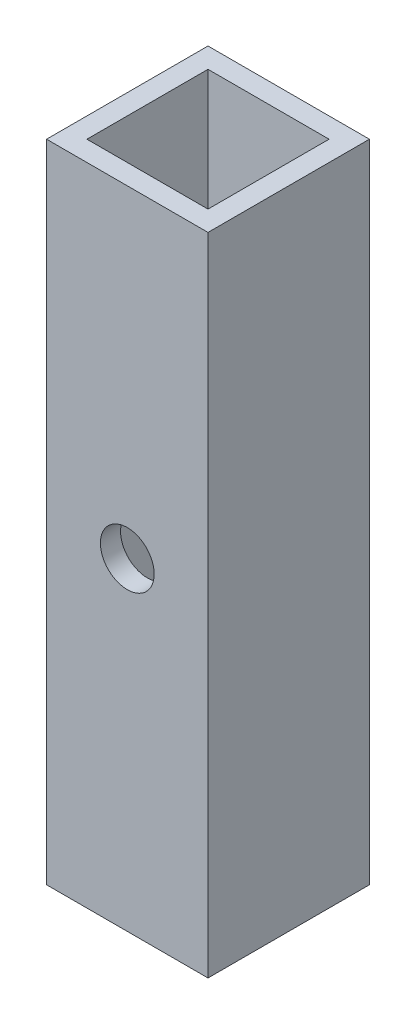
ISO-10303-21;
HEADER;
FILE_DESCRIPTION(('STEP AP214'),'2;1');
FILE_NAME('part.step','',(''),(''),'','','');
FILE_SCHEMA(('AUTOMOTIVE_DESIGN { 1 0 10303 214 1 1 1 1 }'));
ENDSEC;
DATA;
#1=APPLICATION_CONTEXT('core data for automotive mechanical design processes');
#2=APPLICATION_PROTOCOL_DEFINITION('international standard','automotive_design',2000,#1);
#3=PRODUCT_CONTEXT('',#1,'mechanical');
#4=PRODUCT('Part','Part','',(#3));
#5=PRODUCT_RELATED_PRODUCT_CATEGORY('part','',(#4));
#6=PRODUCT_DEFINITION_FORMATION('','',#4);
#7=PRODUCT_DEFINITION_CONTEXT('part definition',#1,'design');
#8=PRODUCT_DEFINITION('design','',#6,#7);
#9=PRODUCT_DEFINITION_SHAPE('','',#8);
#10=(LENGTH_UNIT() NAMED_UNIT(*) SI_UNIT(.MILLI.,.METRE.));
#11=(NAMED_UNIT(*) PLANE_ANGLE_UNIT() SI_UNIT($,.RADIAN.));
#12=(NAMED_UNIT(*) SI_UNIT($,.STERADIAN.) SOLID_ANGLE_UNIT());
#13=UNCERTAINTY_MEASURE_WITH_UNIT(LENGTH_MEASURE(1.E-05),#10,'distance_accuracy_value','');
#14=(GEOMETRIC_REPRESENTATION_CONTEXT(3) GLOBAL_UNCERTAINTY_ASSIGNED_CONTEXT((#13)) GLOBAL_UNIT_ASSIGNED_CONTEXT((#10,
#11,#12)) REPRESENTATION_CONTEXT('',''));
#15=CARTESIAN_POINT('',(0.,0.,0.));
#16=DIRECTION('',(0.,0.,1.));
#17=DIRECTION('',(1.,0.,0.));
#18=AXIS2_PLACEMENT_3D('',#15,#16,#17);
#19=CARTESIAN_POINT('',(0.,152.4,0.));
#20=DIRECTION('',(0.,-1.,0.));
#21=DIRECTION('',(0.,0.,-1.));
#22=AXIS2_PLACEMENT_3D('',#19,#20,#21);
#23=PLANE('',#22);
#24=DIRECTION('',(0.,0.,1.));
#25=VECTOR('',#24,1.);
#26=CARTESIAN_POINT('',(0.,152.4,0.));
#27=LINE('',#26,#25);
#28=CARTESIAN_POINT('',(0.,152.4,-38.1));
#29=VERTEX_POINT('',#28);
#30=CARTESIAN_POINT('',(0.,152.4,0.));
#31=VERTEX_POINT('',#30);
#32=EDGE_CURVE('E139',#29,#31,#27,.T.);
#33=ORIENTED_EDGE('',*,*,#32,.T.);
#34=DIRECTION('',(1.,0.,0.));
#35=VECTOR('',#34,1.);
#36=CARTESIAN_POINT('',(0.,152.4,0.));
#37=LINE('',#36,#35);
#38=CARTESIAN_POINT('',(38.1,152.4,0.));
#39=VERTEX_POINT('',#38);
#40=EDGE_CURVE('E142',#31,#39,#37,.T.);
#41=ORIENTED_EDGE('',*,*,#40,.T.);
#42=DIRECTION('',(0.,0.,-1.));
#43=VECTOR('',#42,1.);
#44=CARTESIAN_POINT('',(38.1,152.4,0.));
#45=LINE('',#44,#43);
#46=CARTESIAN_POINT('',(38.1,152.4,-38.1));
#47=VERTEX_POINT('',#46);
#48=EDGE_CURVE('E145',#39,#47,#45,.T.);
#49=ORIENTED_EDGE('',*,*,#48,.T.);
#50=DIRECTION('',(-1.,0.,0.));
#51=VECTOR('',#50,1.);
#52=CARTESIAN_POINT('',(0.,152.4,-38.1));
#53=LINE('',#52,#51);
#54=EDGE_CURVE('E147',#47,#29,#53,.T.);
#55=ORIENTED_EDGE('',*,*,#54,.T.);
#56=EDGE_LOOP('',(#33,#41,#49,#55));
#57=FACE_BOUND('',#56,.T.);
#58=DIRECTION('',(0.,0.,1.));
#59=VECTOR('',#58,1.);
#60=CARTESIAN_POINT('',(4.7625,152.4,-4.7625));
#61=LINE('',#60,#59);
#62=CARTESIAN_POINT('',(4.7625,152.4,-33.3375));
#63=VERTEX_POINT('',#62);
#64=CARTESIAN_POINT('',(4.7625,152.4,-4.7625));
#65=VERTEX_POINT('',#64);
#66=EDGE_CURVE('E101',#63,#65,#61,.T.);
#67=ORIENTED_EDGE('',*,*,#66,.F.);
#68=DIRECTION('',(-1.,0.,0.));
#69=VECTOR('',#68,1.);
#70=CARTESIAN_POINT('',(4.7625,152.4,-33.3375));
#71=LINE('',#70,#69);
#72=CARTESIAN_POINT('',(33.3375,152.4,-33.3375));
#73=VERTEX_POINT('',#72);
#74=EDGE_CURVE('E123',#73,#63,#71,.T.);
#75=ORIENTED_EDGE('',*,*,#74,.F.);
#76=DIRECTION('',(0.,0.,-1.));
#77=VECTOR('',#76,1.);
#78=CARTESIAN_POINT('',(33.3375,152.4,-4.7625));
#79=LINE('',#78,#77);
#80=CARTESIAN_POINT('',(33.3375,152.4,-4.7625));
#81=VERTEX_POINT('',#80);
#82=EDGE_CURVE('E121',#81,#73,#79,.T.);
#83=ORIENTED_EDGE('',*,*,#82,.F.);
#84=DIRECTION('',(1.,0.,0.));
#85=VECTOR('',#84,1.);
#86=CARTESIAN_POINT('',(4.7625,152.4,-4.7625));
#87=LINE('',#86,#85);
#88=EDGE_CURVE('E109',#65,#81,#87,.T.);
#89=ORIENTED_EDGE('',*,*,#88,.F.);
#90=EDGE_LOOP('',(#67,#75,#83,#89));
#91=FACE_BOUND('',#90,.T.);
#92=ADVANCED_FACE('F35',(#57,#91),#23,.F.);
#93=CARTESIAN_POINT('',(0.,0.,0.));
#94=DIRECTION('',(0.,-1.,0.));
#95=DIRECTION('',(0.,0.,-1.));
#96=AXIS2_PLACEMENT_3D('',#93,#94,#95);
#97=PLANE('',#96);
#98=DIRECTION('',(0.,0.,1.));
#99=VECTOR('',#98,1.);
#100=CARTESIAN_POINT('',(0.,0.,0.));
#101=LINE('',#100,#99);
#102=CARTESIAN_POINT('',(0.,0.,-38.1));
#103=VERTEX_POINT('',#102);
#104=CARTESIAN_POINT('',(0.,0.,0.));
#105=VERTEX_POINT('',#104);
#106=EDGE_CURVE('E117',#103,#105,#101,.T.);
#107=ORIENTED_EDGE('',*,*,#106,.F.);
#108=DIRECTION('',(-1.,0.,0.));
#109=VECTOR('',#108,1.);
#110=CARTESIAN_POINT('',(0.,0.,-38.1));
#111=LINE('',#110,#109);
#112=CARTESIAN_POINT('',(38.1,0.,-38.1));
#113=VERTEX_POINT('',#112);
#114=EDGE_CURVE('E143',#113,#103,#111,.T.);
#115=ORIENTED_EDGE('',*,*,#114,.F.);
#116=DIRECTION('',(0.,0.,-1.));
#117=VECTOR('',#116,1.);
#118=CARTESIAN_POINT('',(38.1,0.,0.));
#119=LINE('',#118,#117);
#120=CARTESIAN_POINT('',(38.1,0.,0.));
#121=VERTEX_POINT('',#120);
#122=EDGE_CURVE('E154',#121,#113,#119,.T.);
#123=ORIENTED_EDGE('',*,*,#122,.F.);
#124=DIRECTION('',(1.,0.,0.));
#125=VECTOR('',#124,1.);
#126=CARTESIAN_POINT('',(0.,0.,0.));
#127=LINE('',#126,#125);
#128=EDGE_CURVE('E152',#105,#121,#127,.T.);
#129=ORIENTED_EDGE('',*,*,#128,.F.);
#130=EDGE_LOOP('',(#107,#115,#123,#129));
#131=FACE_BOUND('',#130,.T.);
#132=DIRECTION('',(-1.,0.,0.));
#133=VECTOR('',#132,1.);
#134=CARTESIAN_POINT('',(4.7625,0.,-33.3375));
#135=LINE('',#134,#133);
#136=CARTESIAN_POINT('',(33.3375,0.,-33.3375));
#137=VERTEX_POINT('',#136);
#138=CARTESIAN_POINT('',(4.7625,0.,-33.3375));
#139=VERTEX_POINT('',#138);
#140=EDGE_CURVE('E110',#137,#139,#135,.T.);
#141=ORIENTED_EDGE('',*,*,#140,.T.);
#142=DIRECTION('',(0.,0.,1.));
#143=VECTOR('',#142,1.);
#144=CARTESIAN_POINT('',(4.7625,0.,-4.7625));
#145=LINE('',#144,#143);
#146=CARTESIAN_POINT('',(4.7625,0.,-4.7625));
#147=VERTEX_POINT('',#146);
#148=EDGE_CURVE('E59',#139,#147,#145,.T.);
#149=ORIENTED_EDGE('',*,*,#148,.T.);
#150=DIRECTION('',(1.,0.,0.));
#151=VECTOR('',#150,1.);
#152=CARTESIAN_POINT('',(4.7625,0.,-4.7625));
#153=LINE('',#152,#151);
#154=CARTESIAN_POINT('',(33.3375,0.,-4.7625));
#155=VERTEX_POINT('',#154);
#156=EDGE_CURVE('E116',#147,#155,#153,.T.);
#157=ORIENTED_EDGE('',*,*,#156,.T.);
#158=DIRECTION('',(0.,0.,-1.));
#159=VECTOR('',#158,1.);
#160=CARTESIAN_POINT('',(33.3375,0.,-4.7625));
#161=LINE('',#160,#159);
#162=EDGE_CURVE('E131',#155,#137,#161,.T.);
#163=ORIENTED_EDGE('',*,*,#162,.T.);
#164=EDGE_LOOP('',(#141,#149,#157,#163));
#165=FACE_BOUND('',#164,.T.);
#166=ADVANCED_FACE('F173',(#131,#165),#97,.T.);
#167=CARTESIAN_POINT('',(0.,152.4,0.));
#168=DIRECTION('',(1.,0.,0.));
#169=DIRECTION('',(0.,0.,-1.));
#170=AXIS2_PLACEMENT_3D('',#167,#168,#169);
#171=PLANE('',#170);
#172=ORIENTED_EDGE('',*,*,#106,.T.);
#173=DIRECTION('',(0.,-1.,0.));
#174=VECTOR('',#173,1.);
#175=CARTESIAN_POINT('',(0.,152.4,0.));
#176=LINE('',#175,#174);
#177=EDGE_CURVE('E11',#31,#105,#176,.T.);
#178=ORIENTED_EDGE('',*,*,#177,.F.);
#179=ORIENTED_EDGE('',*,*,#32,.F.);
#180=DIRECTION('',(0.,-1.,0.));
#181=VECTOR('',#180,1.);
#182=CARTESIAN_POINT('',(0.,152.4,-38.1));
#183=LINE('',#182,#181);
#184=EDGE_CURVE('E149',#29,#103,#183,.T.);
#185=ORIENTED_EDGE('',*,*,#184,.T.);
#186=EDGE_LOOP('',(#172,#178,#179,#185));
#187=FACE_BOUND('',#186,.T.);
#188=ADVANCED_FACE('F37',(#187),#171,.F.);
#189=CARTESIAN_POINT('',(0.,152.4,0.));
#190=DIRECTION('',(0.,0.,-1.));
#191=DIRECTION('',(-1.,0.,0.));
#192=AXIS2_PLACEMENT_3D('',#189,#190,#191);
#193=PLANE('',#192);
#194=CARTESIAN_POINT('',(19.05,76.2,0.));
#195=DIRECTION('',(0.,0.,1.));
#196=DIRECTION('',(1.,0.,0.));
#197=AXIS2_PLACEMENT_3D('',#194,#195,#196);
#198=CIRCLE('',#197,6.35);
#199=CARTESIAN_POINT('',(25.4,76.2,0.));
#200=VERTEX_POINT('',#199);
#201=EDGE_CURVE('E210',#200,#200,#198,.T.);
#202=ORIENTED_EDGE('',*,*,#201,.F.);
#203=EDGE_LOOP('',(#202));
#204=FACE_BOUND('',#203,.T.);
#205=ORIENTED_EDGE('',*,*,#128,.T.);
#206=DIRECTION('',(0.,-1.,0.));
#207=VECTOR('',#206,1.);
#208=CARTESIAN_POINT('',(38.1,152.4,0.));
#209=LINE('',#208,#207);
#210=EDGE_CURVE('E44',#39,#121,#209,.T.);
#211=ORIENTED_EDGE('',*,*,#210,.F.);
#212=ORIENTED_EDGE('',*,*,#40,.F.);
#213=ORIENTED_EDGE('',*,*,#177,.T.);
#214=EDGE_LOOP('',(#205,#211,#212,#213));
#215=FACE_BOUND('',#214,.T.);
#216=ADVANCED_FACE('F183',(#204,#215),#193,.F.);
#217=CARTESIAN_POINT('',(38.1,152.4,0.));
#218=DIRECTION('',(-1.,0.,0.));
#219=DIRECTION('',(0.,0.,1.));
#220=AXIS2_PLACEMENT_3D('',#217,#218,#219);
#221=PLANE('',#220);
#222=ORIENTED_EDGE('',*,*,#122,.T.);
#223=DIRECTION('',(0.,-1.,0.));
#224=VECTOR('',#223,1.);
#225=CARTESIAN_POINT('',(38.1,152.4,-38.1));
#226=LINE('',#225,#224);
#227=EDGE_CURVE('E159',#47,#113,#226,.T.);
#228=ORIENTED_EDGE('',*,*,#227,.F.);
#229=ORIENTED_EDGE('',*,*,#48,.F.);
#230=ORIENTED_EDGE('',*,*,#210,.T.);
#231=EDGE_LOOP('',(#222,#228,#229,#230));
#232=FACE_BOUND('',#231,.T.);
#233=ADVANCED_FACE('F167',(#232),#221,.F.);
#234=CARTESIAN_POINT('',(0.,152.4,-38.1));
#235=DIRECTION('',(0.,0.,1.));
#236=DIRECTION('',(1.,0.,0.));
#237=AXIS2_PLACEMENT_3D('',#234,#235,#236);
#238=PLANE('',#237);
#239=CARTESIAN_POINT('',(19.05,76.2,-38.1));
#240=DIRECTION('',(0.,0.,1.));
#241=DIRECTION('',(1.,0.,0.));
#242=AXIS2_PLACEMENT_3D('',#239,#240,#241);
#243=CIRCLE('',#242,6.34999999999999);
#244=CARTESIAN_POINT('',(25.4,76.2,-38.1));
#245=VERTEX_POINT('',#244);
#246=EDGE_CURVE('E208',#245,#245,#243,.T.);
#247=ORIENTED_EDGE('',*,*,#246,.T.);
#248=EDGE_LOOP('',(#247));
#249=FACE_BOUND('',#248,.T.);
#250=ORIENTED_EDGE('',*,*,#114,.T.);
#251=ORIENTED_EDGE('',*,*,#184,.F.);
#252=ORIENTED_EDGE('',*,*,#54,.F.);
#253=ORIENTED_EDGE('',*,*,#227,.T.);
#254=EDGE_LOOP('',(#250,#251,#252,#253));
#255=FACE_BOUND('',#254,.T.);
#256=ADVANCED_FACE('F177',(#249,#255),#238,.F.);
#257=CARTESIAN_POINT('',(4.7625,152.4,-4.7625));
#258=DIRECTION('',(1.,0.,0.));
#259=DIRECTION('',(0.,0.,-1.));
#260=AXIS2_PLACEMENT_3D('',#257,#258,#259);
#261=PLANE('',#260);
#262=ORIENTED_EDGE('',*,*,#148,.F.);
#263=DIRECTION('',(0.,-1.,0.));
#264=VECTOR('',#263,1.);
#265=CARTESIAN_POINT('',(4.7625,152.4,-33.3375));
#266=LINE('',#265,#264);
#267=EDGE_CURVE('E105',#63,#139,#266,.T.);
#268=ORIENTED_EDGE('',*,*,#267,.F.);
#269=ORIENTED_EDGE('',*,*,#66,.T.);
#270=DIRECTION('',(0.,-1.,0.));
#271=VECTOR('',#270,1.);
#272=CARTESIAN_POINT('',(4.7625,152.4,-4.7625));
#273=LINE('',#272,#271);
#274=EDGE_CURVE('E104',#65,#147,#273,.T.);
#275=ORIENTED_EDGE('',*,*,#274,.T.);
#276=EDGE_LOOP('',(#262,#268,#269,#275));
#277=FACE_BOUND('',#276,.T.);
#278=ADVANCED_FACE('F103',(#277),#261,.T.);
#279=CARTESIAN_POINT('',(4.7625,152.4,-4.7625));
#280=DIRECTION('',(0.,0.,-1.));
#281=DIRECTION('',(-1.,0.,0.));
#282=AXIS2_PLACEMENT_3D('',#279,#280,#281);
#283=PLANE('',#282);
#284=CARTESIAN_POINT('',(19.05,76.2,-4.7625));
#285=DIRECTION('',(0.,0.,-1.));
#286=DIRECTION('',(-1.,0.,0.));
#287=AXIS2_PLACEMENT_3D('',#284,#285,#286);
#288=CIRCLE('',#287,6.34999999999999);
#289=CARTESIAN_POINT('',(12.7,76.2,-4.7625));
#290=VERTEX_POINT('',#289);
#291=EDGE_CURVE('E129',#290,#290,#288,.T.);
#292=ORIENTED_EDGE('',*,*,#291,.F.);
#293=EDGE_LOOP('',(#292));
#294=FACE_BOUND('',#293,.T.);
#295=ORIENTED_EDGE('',*,*,#156,.F.);
#296=ORIENTED_EDGE('',*,*,#274,.F.);
#297=ORIENTED_EDGE('',*,*,#88,.T.);
#298=DIRECTION('',(0.,-1.,0.));
#299=VECTOR('',#298,1.);
#300=CARTESIAN_POINT('',(33.3375,152.4,-4.7625));
#301=LINE('',#300,#299);
#302=EDGE_CURVE('E118',#81,#155,#301,.T.);
#303=ORIENTED_EDGE('',*,*,#302,.T.);
#304=EDGE_LOOP('',(#295,#296,#297,#303));
#305=FACE_BOUND('',#304,.T.);
#306=ADVANCED_FACE('F113',(#294,#305),#283,.T.);
#307=CARTESIAN_POINT('',(33.3375,152.4,-4.7625));
#308=DIRECTION('',(-1.,0.,0.));
#309=DIRECTION('',(0.,0.,1.));
#310=AXIS2_PLACEMENT_3D('',#307,#308,#309);
#311=PLANE('',#310);
#312=ORIENTED_EDGE('',*,*,#162,.F.);
#313=ORIENTED_EDGE('',*,*,#302,.F.);
#314=ORIENTED_EDGE('',*,*,#82,.T.);
#315=DIRECTION('',(0.,-1.,0.));
#316=VECTOR('',#315,1.);
#317=CARTESIAN_POINT('',(33.3375,152.4,-33.3375));
#318=LINE('',#317,#316);
#319=EDGE_CURVE('E51',#73,#137,#318,.T.);
#320=ORIENTED_EDGE('',*,*,#319,.T.);
#321=EDGE_LOOP('',(#312,#313,#314,#320));
#322=FACE_BOUND('',#321,.T.);
#323=ADVANCED_FACE('F222',(#322),#311,.T.);
#324=CARTESIAN_POINT('',(4.7625,152.4,-33.3375));
#325=DIRECTION('',(0.,0.,1.));
#326=DIRECTION('',(1.,0.,0.));
#327=AXIS2_PLACEMENT_3D('',#324,#325,#326);
#328=PLANE('',#327);
#329=CARTESIAN_POINT('',(19.05,76.2,-33.3375));
#330=DIRECTION('',(0.,0.,1.));
#331=DIRECTION('',(1.,0.,0.));
#332=AXIS2_PLACEMENT_3D('',#329,#330,#331);
#333=CIRCLE('',#332,6.34999999999999);
#334=CARTESIAN_POINT('',(25.4,76.2,-33.3375));
#335=VERTEX_POINT('',#334);
#336=EDGE_CURVE('E39',#335,#335,#333,.T.);
#337=ORIENTED_EDGE('',*,*,#336,.F.);
#338=EDGE_LOOP('',(#337));
#339=FACE_BOUND('',#338,.T.);
#340=ORIENTED_EDGE('',*,*,#140,.F.);
#341=ORIENTED_EDGE('',*,*,#319,.F.);
#342=ORIENTED_EDGE('',*,*,#74,.T.);
#343=ORIENTED_EDGE('',*,*,#267,.T.);
#344=EDGE_LOOP('',(#340,#341,#342,#343));
#345=FACE_BOUND('',#344,.T.);
#346=ADVANCED_FACE('F226',(#339,#345),#328,.T.);
#347=CARTESIAN_POINT('',(19.05,76.2,0.));
#348=DIRECTION('',(0.,0.,1.));
#349=DIRECTION('',(1.,0.,0.));
#350=AXIS2_PLACEMENT_3D('',#347,#348,#349);
#351=CYLINDRICAL_SURFACE('',#350,6.34999999999999);
#352=ORIENTED_EDGE('',*,*,#336,.T.);
#353=EDGE_LOOP('',(#352));
#354=FACE_BOUND('',#353,.T.);
#355=ORIENTED_EDGE('',*,*,#246,.F.);
#356=EDGE_LOOP('',(#355));
#357=FACE_BOUND('',#356,.T.);
#358=ADVANCED_FACE('F232',(#354,#357),#351,.F.);
#359=ORIENTED_EDGE('',*,*,#291,.T.);
#360=EDGE_LOOP('',(#359));
#361=FACE_BOUND('',#360,.T.);
#362=ORIENTED_EDGE('',*,*,#201,.T.);
#363=EDGE_LOOP('',(#362));
#364=FACE_BOUND('',#363,.T.);
#365=ADVANCED_FACE('F218',(#361,#364),#351,.F.);
#366=CLOSED_SHELL('',(#92,#166,#188,#216,#233,#256,#278,#306,#323,#346,#358,#365));
#367=MANIFOLD_SOLID_BREP('B2',#366);
#368=ADVANCED_BREP_SHAPE_REPRESENTATION('',(#18,#367),#14);
#369=SHAPE_DEFINITION_REPRESENTATION(#9,#368);
ENDSEC;
END-ISO-10303-21;
